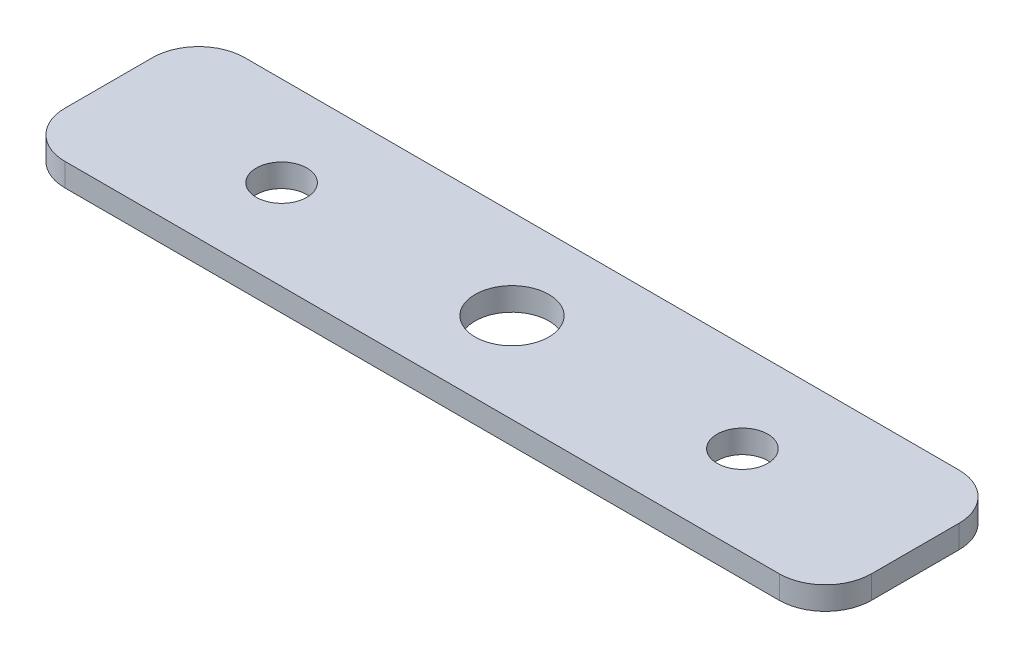
ISO-10303-21;
HEADER;
FILE_DESCRIPTION(('STEP AP214'),'2;1');
FILE_NAME('part.step','',(''),(''),'','','');
FILE_SCHEMA(('AUTOMOTIVE_DESIGN { 1 0 10303 214 1 1 1 1 }'));
ENDSEC;
DATA;
#1=APPLICATION_CONTEXT('core data for automotive mechanical design processes');
#2=APPLICATION_PROTOCOL_DEFINITION('international standard','automotive_design',2000,#1);
#3=PRODUCT_CONTEXT('',#1,'mechanical');
#4=PRODUCT('Part','Part','',(#3));
#5=PRODUCT_RELATED_PRODUCT_CATEGORY('part','',(#4));
#6=PRODUCT_DEFINITION_FORMATION('','',#4);
#7=PRODUCT_DEFINITION_CONTEXT('part definition',#1,'design');
#8=PRODUCT_DEFINITION('design','',#6,#7);
#9=PRODUCT_DEFINITION_SHAPE('','',#8);
#10=(LENGTH_UNIT() NAMED_UNIT(*) SI_UNIT(.MILLI.,.METRE.));
#11=(NAMED_UNIT(*) PLANE_ANGLE_UNIT() SI_UNIT($,.RADIAN.));
#12=(NAMED_UNIT(*) SI_UNIT($,.STERADIAN.) SOLID_ANGLE_UNIT());
#13=UNCERTAINTY_MEASURE_WITH_UNIT(LENGTH_MEASURE(1.E-05),#10,'distance_accuracy_value','');
#14=(GEOMETRIC_REPRESENTATION_CONTEXT(3) GLOBAL_UNCERTAINTY_ASSIGNED_CONTEXT((#13)) GLOBAL_UNIT_ASSIGNED_CONTEXT((#10,
#11,#12)) REPRESENTATION_CONTEXT('',''));
#15=CARTESIAN_POINT('',(0.,0.,0.));
#16=DIRECTION('',(0.,0.,1.));
#17=DIRECTION('',(1.,0.,0.));
#18=AXIS2_PLACEMENT_3D('',#15,#16,#17);
#19=CARTESIAN_POINT('',(35.,2.,7.8));
#20=DIRECTION('',(-1.,0.,0.));
#21=DIRECTION('',(0.,0.,1.));
#22=AXIS2_PLACEMENT_3D('',#19,#20,#21);
#23=PLANE('',#22);
#24=DIRECTION('',(0.,0.,-1.));
#25=VECTOR('',#24,1.);
#26=CARTESIAN_POINT('',(35.,0.,7.8));
#27=LINE('',#26,#25);
#28=CARTESIAN_POINT('',(35.,0.,3.8));
#29=VERTEX_POINT('',#28);
#30=CARTESIAN_POINT('',(35.,0.,-3.8));
#31=VERTEX_POINT('',#30);
#32=EDGE_CURVE('E132',#29,#31,#27,.T.);
#33=ORIENTED_EDGE('',*,*,#32,.T.);
#34=DIRECTION('',(0.,-1.,0.));
#35=VECTOR('',#34,1.);
#36=CARTESIAN_POINT('',(35.,2.,-3.8));
#37=LINE('',#36,#35);
#38=CARTESIAN_POINT('',(35.,2.,-3.8));
#39=VERTEX_POINT('',#38);
#40=EDGE_CURVE('E110',#31,#39,#37,.F.);
#41=ORIENTED_EDGE('',*,*,#40,.T.);
#42=DIRECTION('',(0.,0.,-1.));
#43=VECTOR('',#42,1.);
#44=CARTESIAN_POINT('',(35.,2.,7.8));
#45=LINE('',#44,#43);
#46=CARTESIAN_POINT('',(35.,2.,3.8));
#47=VERTEX_POINT('',#46);
#48=EDGE_CURVE('E142',#47,#39,#45,.T.);
#49=ORIENTED_EDGE('',*,*,#48,.F.);
#50=DIRECTION('',(0.,-1.,0.));
#51=VECTOR('',#50,1.);
#52=CARTESIAN_POINT('',(35.,2.,3.8));
#53=LINE('',#52,#51);
#54=EDGE_CURVE('E115',#47,#29,#53,.T.);
#55=ORIENTED_EDGE('',*,*,#54,.T.);
#56=EDGE_LOOP('',(#33,#41,#49,#55));
#57=FACE_BOUND('',#56,.T.);
#58=ADVANCED_FACE('F39',(#57),#23,.F.);
#59=CARTESIAN_POINT('',(-35.,2.,-7.8));
#60=DIRECTION('',(0.,0.,1.));
#61=DIRECTION('',(1.,0.,0.));
#62=AXIS2_PLACEMENT_3D('',#59,#60,#61);
#63=PLANE('',#62);
#64=DIRECTION('',(-1.,0.,0.));
#65=VECTOR('',#64,1.);
#66=CARTESIAN_POINT('',(-35.,2.,-7.8));
#67=LINE('',#66,#65);
#68=CARTESIAN_POINT('',(31.,2.,-7.8));
#69=VERTEX_POINT('',#68);
#70=CARTESIAN_POINT('',(-31.,2.,-7.8));
#71=VERTEX_POINT('',#70);
#72=EDGE_CURVE('E125',#69,#71,#67,.T.);
#73=ORIENTED_EDGE('',*,*,#72,.F.);
#74=DIRECTION('',(0.,-1.,0.));
#75=VECTOR('',#74,1.);
#76=CARTESIAN_POINT('',(31.,2.,-7.8));
#77=LINE('',#76,#75);
#78=CARTESIAN_POINT('',(31.,0.,-7.8));
#79=VERTEX_POINT('',#78);
#80=EDGE_CURVE('E109',#69,#79,#77,.T.);
#81=ORIENTED_EDGE('',*,*,#80,.T.);
#82=DIRECTION('',(-1.,0.,0.));
#83=VECTOR('',#82,1.);
#84=CARTESIAN_POINT('',(-35.,0.,-7.8));
#85=LINE('',#84,#83);
#86=CARTESIAN_POINT('',(-31.,0.,-7.8));
#87=VERTEX_POINT('',#86);
#88=EDGE_CURVE('E122',#79,#87,#85,.T.);
#89=ORIENTED_EDGE('',*,*,#88,.T.);
#90=DIRECTION('',(0.,-1.,0.));
#91=VECTOR('',#90,1.);
#92=CARTESIAN_POINT('',(-31.,2.,-7.8));
#93=LINE('',#92,#91);
#94=EDGE_CURVE('E127',#87,#71,#93,.F.);
#95=ORIENTED_EDGE('',*,*,#94,.T.);
#96=EDGE_LOOP('',(#73,#81,#89,#95));
#97=FACE_BOUND('',#96,.T.);
#98=ADVANCED_FACE('F121',(#97),#63,.F.);
#99=CARTESIAN_POINT('',(-35.,2.,7.8));
#100=DIRECTION('',(1.,0.,0.));
#101=DIRECTION('',(0.,0.,-1.));
#102=AXIS2_PLACEMENT_3D('',#99,#100,#101);
#103=PLANE('',#102);
#104=DIRECTION('',(0.,0.,1.));
#105=VECTOR('',#104,1.);
#106=CARTESIAN_POINT('',(-35.,0.,7.8));
#107=LINE('',#106,#105);
#108=CARTESIAN_POINT('',(-35.,0.,-3.8));
#109=VERTEX_POINT('',#108);
#110=CARTESIAN_POINT('',(-35.,0.,3.8));
#111=VERTEX_POINT('',#110);
#112=EDGE_CURVE('E131',#109,#111,#107,.T.);
#113=ORIENTED_EDGE('',*,*,#112,.T.);
#114=DIRECTION('',(0.,-1.,0.));
#115=VECTOR('',#114,1.);
#116=CARTESIAN_POINT('',(-35.,2.,3.8));
#117=LINE('',#116,#115);
#118=CARTESIAN_POINT('',(-35.,2.,3.8));
#119=VERTEX_POINT('',#118);
#120=EDGE_CURVE('E11',#111,#119,#117,.F.);
#121=ORIENTED_EDGE('',*,*,#120,.T.);
#122=DIRECTION('',(0.,0.,1.));
#123=VECTOR('',#122,1.);
#124=CARTESIAN_POINT('',(-35.,2.,7.8));
#125=LINE('',#124,#123);
#126=CARTESIAN_POINT('',(-35.,2.,-3.8));
#127=VERTEX_POINT('',#126);
#128=EDGE_CURVE('E177',#127,#119,#125,.T.);
#129=ORIENTED_EDGE('',*,*,#128,.F.);
#130=DIRECTION('',(0.,-1.,0.));
#131=VECTOR('',#130,1.);
#132=CARTESIAN_POINT('',(-35.,2.,-3.8));
#133=LINE('',#132,#131);
#134=EDGE_CURVE('E47',#127,#109,#133,.T.);
#135=ORIENTED_EDGE('',*,*,#134,.T.);
#136=EDGE_LOOP('',(#113,#121,#129,#135));
#137=FACE_BOUND('',#136,.T.);
#138=ADVANCED_FACE('F175',(#137),#103,.F.);
#139=CARTESIAN_POINT('',(-35.,2.,7.8));
#140=DIRECTION('',(0.,0.,-1.));
#141=DIRECTION('',(-1.,0.,0.));
#142=AXIS2_PLACEMENT_3D('',#139,#140,#141);
#143=PLANE('',#142);
#144=DIRECTION('',(1.,0.,0.));
#145=VECTOR('',#144,1.);
#146=CARTESIAN_POINT('',(-35.,0.,7.8));
#147=LINE('',#146,#145);
#148=CARTESIAN_POINT('',(-31.,0.,7.8));
#149=VERTEX_POINT('',#148);
#150=CARTESIAN_POINT('',(31.,0.,7.8));
#151=VERTEX_POINT('',#150);
#152=EDGE_CURVE('E135',#149,#151,#147,.T.);
#153=ORIENTED_EDGE('',*,*,#152,.T.);
#154=DIRECTION('',(0.,-1.,0.));
#155=VECTOR('',#154,1.);
#156=CARTESIAN_POINT('',(31.,2.,7.8));
#157=LINE('',#156,#155);
#158=CARTESIAN_POINT('',(31.,2.,7.8));
#159=VERTEX_POINT('',#158);
#160=EDGE_CURVE('E54',#151,#159,#157,.F.);
#161=ORIENTED_EDGE('',*,*,#160,.T.);
#162=DIRECTION('',(1.,0.,0.));
#163=VECTOR('',#162,1.);
#164=CARTESIAN_POINT('',(-35.,2.,7.8));
#165=LINE('',#164,#163);
#166=CARTESIAN_POINT('',(-31.,2.,7.8));
#167=VERTEX_POINT('',#166);
#168=EDGE_CURVE('E152',#167,#159,#165,.T.);
#169=ORIENTED_EDGE('',*,*,#168,.F.);
#170=DIRECTION('',(0.,-1.,0.));
#171=VECTOR('',#170,1.);
#172=CARTESIAN_POINT('',(-31.,2.,7.8));
#173=LINE('',#172,#171);
#174=EDGE_CURVE('E168',#167,#149,#173,.T.);
#175=ORIENTED_EDGE('',*,*,#174,.T.);
#176=EDGE_LOOP('',(#153,#161,#169,#175));
#177=FACE_BOUND('',#176,.T.);
#178=ADVANCED_FACE('F184',(#177),#143,.F.);
#179=CARTESIAN_POINT('',(0.,2.,0.));
#180=DIRECTION('',(0.,-1.,0.));
#181=DIRECTION('',(0.,0.,-1.));
#182=AXIS2_PLACEMENT_3D('',#179,#180,#181);
#183=PLANE('',#182);
#184=CARTESIAN_POINT('',(-20.,2.,0.));
#185=DIRECTION('',(0.,1.,0.));
#186=DIRECTION('',(0.,0.,-1.));
#187=AXIS2_PLACEMENT_3D('',#184,#185,#186);
#188=CIRCLE('',#187,2.2);
#189=CARTESIAN_POINT('',(-20.,2.,-2.2));
#190=VERTEX_POINT('',#189);
#191=EDGE_CURVE('E194',#190,#190,#188,.T.);
#192=ORIENTED_EDGE('',*,*,#191,.F.);
#193=EDGE_LOOP('',(#192));
#194=FACE_BOUND('',#193,.T.);
#195=CARTESIAN_POINT('',(20.,2.,0.));
#196=DIRECTION('',(0.,1.,0.));
#197=DIRECTION('',(0.,0.,1.));
#198=AXIS2_PLACEMENT_3D('',#195,#196,#197);
#199=CIRCLE('',#198,2.2);
#200=CARTESIAN_POINT('',(20.,2.,2.2));
#201=VERTEX_POINT('',#200);
#202=EDGE_CURVE('E193',#201,#201,#199,.T.);
#203=ORIENTED_EDGE('',*,*,#202,.F.);
#204=EDGE_LOOP('',(#203));
#205=FACE_BOUND('',#204,.T.);
#206=CARTESIAN_POINT('',(0.,2.,0.));
#207=DIRECTION('',(0.,1.,0.));
#208=DIRECTION('',(0.,0.,1.));
#209=AXIS2_PLACEMENT_3D('',#206,#207,#208);
#210=CIRCLE('',#209,3.2);
#211=CARTESIAN_POINT('',(0.,2.,3.2));
#212=VERTEX_POINT('',#211);
#213=EDGE_CURVE('E147',#212,#212,#210,.T.);
#214=ORIENTED_EDGE('',*,*,#213,.F.);
#215=EDGE_LOOP('',(#214));
#216=FACE_BOUND('',#215,.T.);
#217=ORIENTED_EDGE('',*,*,#48,.T.);
#218=CARTESIAN_POINT('',(31.,2.,-3.8));
#219=DIRECTION('',(0.,-1.,0.));
#220=DIRECTION('',(0.,0.,-1.));
#221=AXIS2_PLACEMENT_3D('',#218,#219,#220);
#222=CIRCLE('',#221,4.);
#223=EDGE_CURVE('E166',#39,#69,#222,.F.);
#224=ORIENTED_EDGE('',*,*,#223,.T.);
#225=ORIENTED_EDGE('',*,*,#72,.T.);
#226=CARTESIAN_POINT('',(-31.,2.,-3.8));
#227=DIRECTION('',(0.,-1.,0.));
#228=DIRECTION('',(0.,0.,-1.));
#229=AXIS2_PLACEMENT_3D('',#226,#227,#228);
#230=CIRCLE('',#229,4.);
#231=EDGE_CURVE('E161',#71,#127,#230,.F.);
#232=ORIENTED_EDGE('',*,*,#231,.T.);
#233=ORIENTED_EDGE('',*,*,#128,.T.);
#234=CARTESIAN_POINT('',(-31.,2.,3.8));
#235=DIRECTION('',(0.,-1.,0.));
#236=DIRECTION('',(0.,0.,-1.));
#237=AXIS2_PLACEMENT_3D('',#234,#235,#236);
#238=CIRCLE('',#237,4.);
#239=EDGE_CURVE('E61',#119,#167,#238,.F.);
#240=ORIENTED_EDGE('',*,*,#239,.T.);
#241=ORIENTED_EDGE('',*,*,#168,.T.);
#242=CARTESIAN_POINT('',(31.,2.,3.8));
#243=DIRECTION('',(0.,-1.,0.));
#244=DIRECTION('',(0.,0.,-1.));
#245=AXIS2_PLACEMENT_3D('',#242,#243,#244);
#246=CIRCLE('',#245,4.);
#247=EDGE_CURVE('E164',#159,#47,#246,.F.);
#248=ORIENTED_EDGE('',*,*,#247,.T.);
#249=EDGE_LOOP('',(#217,#224,#225,#232,#233,#240,#241,#248));
#250=FACE_BOUND('',#249,.T.);
#251=ADVANCED_FACE('F202',(#194,#205,#216,#250),#183,.F.);
#252=CARTESIAN_POINT('',(0.,0.,0.));
#253=DIRECTION('',(0.,-1.,0.));
#254=DIRECTION('',(0.,0.,-1.));
#255=AXIS2_PLACEMENT_3D('',#252,#253,#254);
#256=PLANE('',#255);
#257=CARTESIAN_POINT('',(-20.,0.,0.));
#258=DIRECTION('',(0.,-1.,0.));
#259=DIRECTION('',(0.,0.,-1.));
#260=AXIS2_PLACEMENT_3D('',#257,#258,#259);
#261=CIRCLE('',#260,2.2);
#262=CARTESIAN_POINT('',(-20.,0.,-2.2));
#263=VERTEX_POINT('',#262);
#264=EDGE_CURVE('E137',#263,#263,#261,.F.);
#265=ORIENTED_EDGE('',*,*,#264,.T.);
#266=EDGE_LOOP('',(#265));
#267=FACE_BOUND('',#266,.T.);
#268=CARTESIAN_POINT('',(20.,0.,0.));
#269=DIRECTION('',(0.,-1.,0.));
#270=DIRECTION('',(0.,0.,-1.));
#271=AXIS2_PLACEMENT_3D('',#268,#269,#270);
#272=CIRCLE('',#271,2.2);
#273=CARTESIAN_POINT('',(20.,0.,-2.2));
#274=VERTEX_POINT('',#273);
#275=EDGE_CURVE('E146',#274,#274,#272,.F.);
#276=ORIENTED_EDGE('',*,*,#275,.T.);
#277=EDGE_LOOP('',(#276));
#278=FACE_BOUND('',#277,.T.);
#279=CARTESIAN_POINT('',(0.,0.,0.));
#280=DIRECTION('',(0.,-1.,0.));
#281=DIRECTION('',(0.,0.,-1.));
#282=AXIS2_PLACEMENT_3D('',#279,#280,#281);
#283=CIRCLE('',#282,3.2);
#284=CARTESIAN_POINT('',(0.,0.,-3.2));
#285=VERTEX_POINT('',#284);
#286=EDGE_CURVE('E143',#285,#285,#283,.F.);
#287=ORIENTED_EDGE('',*,*,#286,.T.);
#288=EDGE_LOOP('',(#287));
#289=FACE_BOUND('',#288,.T.);
#290=ORIENTED_EDGE('',*,*,#88,.F.);
#291=CARTESIAN_POINT('',(31.,0.,-3.8));
#292=DIRECTION('',(0.,-1.,0.));
#293=DIRECTION('',(0.,0.,-1.));
#294=AXIS2_PLACEMENT_3D('',#291,#292,#293);
#295=CIRCLE('',#294,4.);
#296=EDGE_CURVE('E105',#79,#31,#295,.T.);
#297=ORIENTED_EDGE('',*,*,#296,.T.);
#298=ORIENTED_EDGE('',*,*,#32,.F.);
#299=CARTESIAN_POINT('',(31.,0.,3.8));
#300=DIRECTION('',(0.,-1.,0.));
#301=DIRECTION('',(0.,0.,-1.));
#302=AXIS2_PLACEMENT_3D('',#299,#300,#301);
#303=CIRCLE('',#302,4.);
#304=EDGE_CURVE('E116',#29,#151,#303,.T.);
#305=ORIENTED_EDGE('',*,*,#304,.T.);
#306=ORIENTED_EDGE('',*,*,#152,.F.);
#307=CARTESIAN_POINT('',(-31.,0.,3.8));
#308=DIRECTION('',(0.,-1.,0.));
#309=DIRECTION('',(0.,0.,-1.));
#310=AXIS2_PLACEMENT_3D('',#307,#308,#309);
#311=CIRCLE('',#310,4.);
#312=EDGE_CURVE('E155',#149,#111,#311,.T.);
#313=ORIENTED_EDGE('',*,*,#312,.T.);
#314=ORIENTED_EDGE('',*,*,#112,.F.);
#315=CARTESIAN_POINT('',(-31.,0.,-3.8));
#316=DIRECTION('',(0.,-1.,0.));
#317=DIRECTION('',(0.,0.,-1.));
#318=AXIS2_PLACEMENT_3D('',#315,#316,#317);
#319=CIRCLE('',#318,4.);
#320=EDGE_CURVE('E126',#109,#87,#319,.T.);
#321=ORIENTED_EDGE('',*,*,#320,.T.);
#322=EDGE_LOOP('',(#290,#297,#298,#305,#306,#313,#314,#321));
#323=FACE_BOUND('',#322,.T.);
#324=ADVANCED_FACE('F129',(#267,#278,#289,#323),#256,.T.);
#325=CARTESIAN_POINT('',(0.,2.,0.));
#326=DIRECTION('',(0.,-1.,0.));
#327=DIRECTION('',(0.,0.,-1.));
#328=AXIS2_PLACEMENT_3D('',#325,#326,#327);
#329=CYLINDRICAL_SURFACE('',#328,3.2);
#330=ORIENTED_EDGE('',*,*,#286,.F.);
#331=EDGE_LOOP('',(#330));
#332=FACE_BOUND('',#331,.T.);
#333=ORIENTED_EDGE('',*,*,#213,.T.);
#334=EDGE_LOOP('',(#333));
#335=FACE_BOUND('',#334,.T.);
#336=ADVANCED_FACE('F233',(#332,#335),#329,.F.);
#337=CARTESIAN_POINT('',(20.,2.,0.));
#338=DIRECTION('',(0.,-1.,0.));
#339=DIRECTION('',(0.,0.,-1.));
#340=AXIS2_PLACEMENT_3D('',#337,#338,#339);
#341=CYLINDRICAL_SURFACE('',#340,2.2);
#342=ORIENTED_EDGE('',*,*,#275,.F.);
#343=EDGE_LOOP('',(#342));
#344=FACE_BOUND('',#343,.T.);
#345=ORIENTED_EDGE('',*,*,#202,.T.);
#346=EDGE_LOOP('',(#345));
#347=FACE_BOUND('',#346,.T.);
#348=ADVANCED_FACE('F200',(#344,#347),#341,.F.);
#349=CARTESIAN_POINT('',(-20.,2.,0.));
#350=DIRECTION('',(0.,-1.,0.));
#351=DIRECTION('',(0.,0.,-1.));
#352=AXIS2_PLACEMENT_3D('',#349,#350,#351);
#353=CYLINDRICAL_SURFACE('',#352,2.2);
#354=ORIENTED_EDGE('',*,*,#264,.F.);
#355=EDGE_LOOP('',(#354));
#356=FACE_BOUND('',#355,.T.);
#357=ORIENTED_EDGE('',*,*,#191,.T.);
#358=EDGE_LOOP('',(#357));
#359=FACE_BOUND('',#358,.T.);
#360=ADVANCED_FACE('F219',(#356,#359),#353,.F.);
#361=CARTESIAN_POINT('',(31.,2.,-3.8));
#362=DIRECTION('',(0.,-1.,0.));
#363=DIRECTION('',(0.,0.,-1.));
#364=AXIS2_PLACEMENT_3D('',#361,#362,#363);
#365=CYLINDRICAL_SURFACE('',#364,4.);
#366=ORIENTED_EDGE('',*,*,#223,.F.);
#367=ORIENTED_EDGE('',*,*,#40,.F.);
#368=ORIENTED_EDGE('',*,*,#296,.F.);
#369=ORIENTED_EDGE('',*,*,#80,.F.);
#370=EDGE_LOOP('',(#366,#367,#368,#369));
#371=FACE_BOUND('',#370,.T.);
#372=ADVANCED_FACE('F108',(#371),#365,.T.);
#373=CARTESIAN_POINT('',(31.,2.,3.8));
#374=DIRECTION('',(0.,-1.,0.));
#375=DIRECTION('',(0.,0.,-1.));
#376=AXIS2_PLACEMENT_3D('',#373,#374,#375);
#377=CYLINDRICAL_SURFACE('',#376,4.);
#378=ORIENTED_EDGE('',*,*,#247,.F.);
#379=ORIENTED_EDGE('',*,*,#160,.F.);
#380=ORIENTED_EDGE('',*,*,#304,.F.);
#381=ORIENTED_EDGE('',*,*,#54,.F.);
#382=EDGE_LOOP('',(#378,#379,#380,#381));
#383=FACE_BOUND('',#382,.T.);
#384=ADVANCED_FACE('F212',(#383),#377,.T.);
#385=CARTESIAN_POINT('',(-31.,2.,3.8));
#386=DIRECTION('',(0.,-1.,0.));
#387=DIRECTION('',(0.,0.,-1.));
#388=AXIS2_PLACEMENT_3D('',#385,#386,#387);
#389=CYLINDRICAL_SURFACE('',#388,4.);
#390=ORIENTED_EDGE('',*,*,#239,.F.);
#391=ORIENTED_EDGE('',*,*,#120,.F.);
#392=ORIENTED_EDGE('',*,*,#312,.F.);
#393=ORIENTED_EDGE('',*,*,#174,.F.);
#394=EDGE_LOOP('',(#390,#391,#392,#393));
#395=FACE_BOUND('',#394,.T.);
#396=ADVANCED_FACE('F183',(#395),#389,.T.);
#397=CARTESIAN_POINT('',(-31.,2.,-3.8));
#398=DIRECTION('',(0.,-1.,0.));
#399=DIRECTION('',(0.,0.,-1.));
#400=AXIS2_PLACEMENT_3D('',#397,#398,#399);
#401=CYLINDRICAL_SURFACE('',#400,4.);
#402=ORIENTED_EDGE('',*,*,#231,.F.);
#403=ORIENTED_EDGE('',*,*,#94,.F.);
#404=ORIENTED_EDGE('',*,*,#320,.F.);
#405=ORIENTED_EDGE('',*,*,#134,.F.);
#406=EDGE_LOOP('',(#402,#403,#404,#405));
#407=FACE_BOUND('',#406,.T.);
#408=ADVANCED_FACE('F41',(#407),#401,.T.);
#409=CLOSED_SHELL('',(#58,#98,#138,#178,#251,#324,#336,#348,#360,#372,#384,#396,#408));
#410=MANIFOLD_SOLID_BREP('B2',#409);
#411=ADVANCED_BREP_SHAPE_REPRESENTATION('',(#18,#410),#14);
#412=SHAPE_DEFINITION_REPRESENTATION(#9,#411);
ENDSEC;
END-ISO-10303-21;
